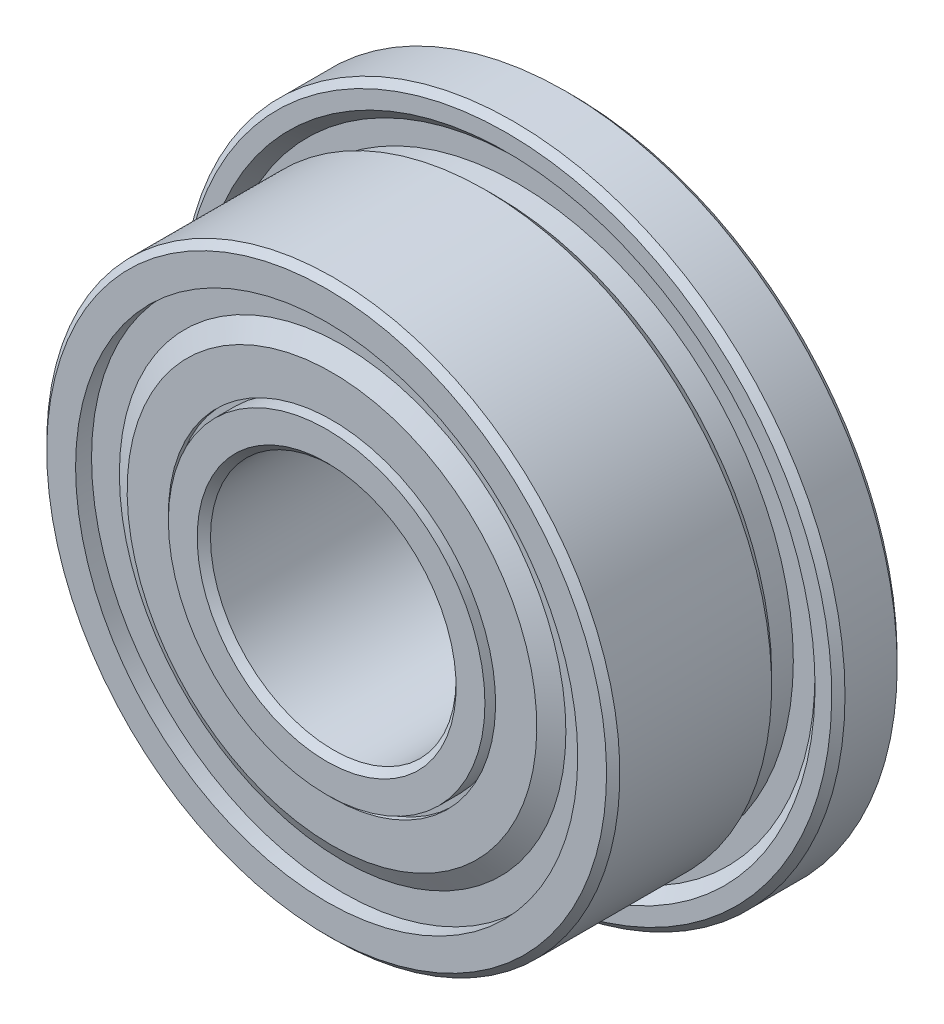
ISO-10303-21;
HEADER;
FILE_DESCRIPTION(('STEP AP214'),'2;1');
FILE_NAME('part.step','',(''),(''),'','','');
FILE_SCHEMA(('AUTOMOTIVE_DESIGN { 1 0 10303 214 1 1 1 1 }'));
ENDSEC;
DATA;
#1=APPLICATION_CONTEXT('core data for automotive mechanical design processes');
#2=APPLICATION_PROTOCOL_DEFINITION('international standard','automotive_design',2000,#1);
#3=PRODUCT_CONTEXT('',#1,'mechanical');
#4=PRODUCT('Part','Part','',(#3));
#5=PRODUCT_RELATED_PRODUCT_CATEGORY('part','',(#4));
#6=PRODUCT_DEFINITION_FORMATION('','',#4);
#7=PRODUCT_DEFINITION_CONTEXT('part definition',#1,'design');
#8=PRODUCT_DEFINITION('design','',#6,#7);
#9=PRODUCT_DEFINITION_SHAPE('','',#8);
#10=(LENGTH_UNIT() NAMED_UNIT(*) SI_UNIT(.MILLI.,.METRE.));
#11=(NAMED_UNIT(*) PLANE_ANGLE_UNIT() SI_UNIT($,.RADIAN.));
#12=(NAMED_UNIT(*) SI_UNIT($,.STERADIAN.) SOLID_ANGLE_UNIT());
#13=UNCERTAINTY_MEASURE_WITH_UNIT(LENGTH_MEASURE(1.E-05),#10,'distance_accuracy_value','');
#14=(GEOMETRIC_REPRESENTATION_CONTEXT(3) GLOBAL_UNCERTAINTY_ASSIGNED_CONTEXT((#13)) GLOBAL_UNIT_ASSIGNED_CONTEXT((#10,
#11,#12)) REPRESENTATION_CONTEXT('',''));
#15=CARTESIAN_POINT('',(0.,0.,0.));
#16=DIRECTION('',(0.,0.,1.));
#17=DIRECTION('',(1.,0.,0.));
#18=AXIS2_PLACEMENT_3D('',#15,#16,#17);
#19=CARTESIAN_POINT('',(0.,0.,0.));
#20=DIRECTION('',(0.,0.,1.));
#21=DIRECTION('',(0.,-1.,0.));
#22=AXIS2_PLACEMENT_3D('',#19,#20,#21);
#23=CYLINDRICAL_SURFACE('',#22,3.06666666666667);
#24=CARTESIAN_POINT('',(0.,0.,-1.24));
#25=DIRECTION('',(0.,0.,1.));
#26=DIRECTION('',(0.,-1.,0.));
#27=AXIS2_PLACEMENT_3D('',#24,#25,#26);
#28=CIRCLE('',#27,3.06666666666667);
#29=CARTESIAN_POINT('',(0.,-3.06666666666667,-1.24));
#30=VERTEX_POINT('',#29);
#31=EDGE_CURVE('E91',#30,#30,#28,.T.);
#32=ORIENTED_EDGE('',*,*,#31,.F.);
#33=EDGE_LOOP('',(#32));
#34=FACE_BOUND('',#33,.T.);
#35=CARTESIAN_POINT('',(0.,0.,-1.305));
#36=DIRECTION('',(0.,0.,1.));
#37=DIRECTION('',(0.,-1.,0.));
#38=AXIS2_PLACEMENT_3D('',#35,#36,#37);
#39=CIRCLE('',#38,3.06666666666667);
#40=CARTESIAN_POINT('',(0.,-3.06666666666667,-1.305));
#41=VERTEX_POINT('',#40);
#42=EDGE_CURVE('E12',#41,#41,#39,.T.);
#43=ORIENTED_EDGE('',*,*,#42,.T.);
#44=EDGE_LOOP('',(#43));
#45=FACE_BOUND('',#44,.T.);
#46=ADVANCED_FACE('F54',(#34,#45),#23,.T.);
#47=CARTESIAN_POINT('',(0.,3.06666666666667,-1.305));
#48=DIRECTION('',(0.,0.,1.));
#49=DIRECTION('',(0.,-1.,0.));
#50=AXIS2_PLACEMENT_3D('',#47,#48,#49);
#51=PLANE('',#50);
#52=ORIENTED_EDGE('',*,*,#42,.F.);
#53=EDGE_LOOP('',(#52));
#54=FACE_BOUND('',#53,.T.);
#55=CARTESIAN_POINT('',(0.,0.,-1.305));
#56=DIRECTION('',(0.,0.,1.));
#57=DIRECTION('',(0.,-1.,0.));
#58=AXIS2_PLACEMENT_3D('',#55,#56,#57);
#59=CIRCLE('',#58,2.72694050703183);
#60=CARTESIAN_POINT('',(0.,-2.72694050703183,-1.305));
#61=VERTEX_POINT('',#60);
#62=EDGE_CURVE('E61',#61,#61,#59,.T.);
#63=ORIENTED_EDGE('',*,*,#62,.T.);
#64=EDGE_LOOP('',(#63));
#65=FACE_BOUND('',#64,.T.);
#66=ADVANCED_FACE('F100',(#54,#65),#51,.F.);
#67=CARTESIAN_POINT('',(0.,0.,-1.435));
#68=DIRECTION('',(0.,0.,1.));
#69=DIRECTION('',(0.,-1.,0.));
#70=AXIS2_PLACEMENT_3D('',#67,#68,#69);
#71=CONICAL_SURFACE('',#70,2.50177390204788,1.0471975511966);
#72=ORIENTED_EDGE('',*,*,#62,.F.);
#73=EDGE_LOOP('',(#72));
#74=FACE_BOUND('',#73,.T.);
#75=CARTESIAN_POINT('',(0.,0.,-1.435));
#76=DIRECTION('',(0.,0.,1.));
#77=DIRECTION('',(0.,-1.,0.));
#78=AXIS2_PLACEMENT_3D('',#75,#76,#77);
#79=CIRCLE('',#78,2.50177390204788);
#80=CARTESIAN_POINT('',(0.,-2.50177390204788,-1.435));
#81=VERTEX_POINT('',#80);
#82=EDGE_CURVE('E67',#81,#81,#79,.T.);
#83=ORIENTED_EDGE('',*,*,#82,.T.);
#84=EDGE_LOOP('',(#83));
#85=FACE_BOUND('',#84,.T.);
#86=ADVANCED_FACE('F104',(#74,#85),#71,.T.);
#87=CARTESIAN_POINT('',(0.,2.50177390204788,-1.435));
#88=DIRECTION('',(0.,0.,1.));
#89=DIRECTION('',(0.,-1.,0.));
#90=AXIS2_PLACEMENT_3D('',#87,#88,#89);
#91=PLANE('',#90);
#92=ORIENTED_EDGE('',*,*,#82,.F.);
#93=EDGE_LOOP('',(#92));
#94=FACE_BOUND('',#93,.T.);
#95=CARTESIAN_POINT('',(0.,0.,-1.435));
#96=DIRECTION('',(0.,0.,1.));
#97=DIRECTION('',(0.,-1.,0.));
#98=AXIS2_PLACEMENT_3D('',#95,#96,#97);
#99=CIRCLE('',#98,1.99833333333333);
#100=CARTESIAN_POINT('',(0.,-1.99833333333333,-1.435));
#101=VERTEX_POINT('',#100);
#102=EDGE_CURVE('E73',#101,#101,#99,.T.);
#103=ORIENTED_EDGE('',*,*,#102,.T.);
#104=EDGE_LOOP('',(#103));
#105=FACE_BOUND('',#104,.T.);
#106=ADVANCED_FACE('F109',(#94,#105),#91,.F.);
#107=CARTESIAN_POINT('',(0.,0.,0.));
#108=DIRECTION('',(0.,0.,1.));
#109=DIRECTION('',(0.,-1.,0.));
#110=AXIS2_PLACEMENT_3D('',#107,#108,#109);
#111=CYLINDRICAL_SURFACE('',#110,1.99833333333333);
#112=ORIENTED_EDGE('',*,*,#102,.F.);
#113=EDGE_LOOP('',(#112));
#114=FACE_BOUND('',#113,.T.);
#115=CARTESIAN_POINT('',(0.,0.,-1.37));
#116=DIRECTION('',(0.,0.,1.));
#117=DIRECTION('',(0.,-1.,0.));
#118=AXIS2_PLACEMENT_3D('',#115,#116,#117);
#119=CIRCLE('',#118,1.99833333333333);
#120=CARTESIAN_POINT('',(0.,-1.99833333333333,-1.37));
#121=VERTEX_POINT('',#120);
#122=EDGE_CURVE('E79',#121,#121,#119,.T.);
#123=ORIENTED_EDGE('',*,*,#122,.T.);
#124=EDGE_LOOP('',(#123));
#125=FACE_BOUND('',#124,.T.);
#126=ADVANCED_FACE('F115',(#114,#125),#111,.F.);
#127=CARTESIAN_POINT('',(0.,2.48435720453986,-1.37));
#128=DIRECTION('',(0.,0.,-1.));
#129=DIRECTION('',(0.,1.,0.));
#130=AXIS2_PLACEMENT_3D('',#127,#128,#129);
#131=PLANE('',#130);
#132=ORIENTED_EDGE('',*,*,#122,.F.);
#133=EDGE_LOOP('',(#132));
#134=FACE_BOUND('',#133,.T.);
#135=CARTESIAN_POINT('',(0.,0.,-1.37));
#136=DIRECTION('',(0.,0.,1.));
#137=DIRECTION('',(0.,-1.,0.));
#138=AXIS2_PLACEMENT_3D('',#135,#136,#137);
#139=CIRCLE('',#138,2.48435720453986);
#140=CARTESIAN_POINT('',(0.,-2.48435720453986,-1.37));
#141=VERTEX_POINT('',#140);
#142=EDGE_CURVE('E83',#141,#141,#139,.T.);
#143=ORIENTED_EDGE('',*,*,#142,.T.);
#144=EDGE_LOOP('',(#143));
#145=FACE_BOUND('',#144,.T.);
#146=ADVANCED_FACE('F119',(#134,#145),#131,.F.);
#147=CARTESIAN_POINT('',(0.,0.,-1.24));
#148=DIRECTION('',(0.,0.,1.));
#149=DIRECTION('',(0.,-1.,0.));
#150=AXIS2_PLACEMENT_3D('',#147,#148,#149);
#151=CONICAL_SURFACE('',#150,2.70952380952381,1.0471975511966);
#152=ORIENTED_EDGE('',*,*,#142,.F.);
#153=EDGE_LOOP('',(#152));
#154=FACE_BOUND('',#153,.T.);
#155=CARTESIAN_POINT('',(0.,0.,-1.24));
#156=DIRECTION('',(0.,0.,1.));
#157=DIRECTION('',(0.,-1.,0.));
#158=AXIS2_PLACEMENT_3D('',#155,#156,#157);
#159=CIRCLE('',#158,2.70952380952381);
#160=CARTESIAN_POINT('',(0.,-2.70952380952381,-1.24));
#161=VERTEX_POINT('',#160);
#162=EDGE_CURVE('E87',#161,#161,#159,.T.);
#163=ORIENTED_EDGE('',*,*,#162,.T.);
#164=EDGE_LOOP('',(#163));
#165=FACE_BOUND('',#164,.T.);
#166=ADVANCED_FACE('F123',(#154,#165),#151,.F.);
#167=CARTESIAN_POINT('',(0.,3.06666666666667,-1.24));
#168=DIRECTION('',(0.,0.,-1.));
#169=DIRECTION('',(0.,1.,0.));
#170=AXIS2_PLACEMENT_3D('',#167,#168,#169);
#171=PLANE('',#170);
#172=ORIENTED_EDGE('',*,*,#162,.F.);
#173=EDGE_LOOP('',(#172));
#174=FACE_BOUND('',#173,.T.);
#175=ORIENTED_EDGE('',*,*,#31,.T.);
#176=EDGE_LOOP('',(#175));
#177=FACE_BOUND('',#176,.T.);
#178=ADVANCED_FACE('F97',(#174,#177),#171,.F.);
#179=CLOSED_SHELL('',(#46,#66,#86,#106,#126,#146,#166,#178));
#180=MANIFOLD_SOLID_BREP('B2',#179);
#181=CARTESIAN_POINT('',(0.,0.,0.));
#182=DIRECTION('',(0.,0.,1.));
#183=DIRECTION('',(0.,-1.,0.));
#184=AXIS2_PLACEMENT_3D('',#181,#182,#183);
#185=CYLINDRICAL_SURFACE('',#184,3.06666666666667);
#186=CARTESIAN_POINT('',(0.,0.,1.305));
#187=DIRECTION('',(0.,0.,1.));
#188=DIRECTION('',(0.,-1.,0.));
#189=AXIS2_PLACEMENT_3D('',#186,#187,#188);
#190=CIRCLE('',#189,3.06666666666667);
#191=CARTESIAN_POINT('',(0.,-3.06666666666667,1.305));
#192=VERTEX_POINT('',#191);
#193=EDGE_CURVE('E53',#192,#192,#190,.T.);
#194=ORIENTED_EDGE('',*,*,#193,.F.);
#195=EDGE_LOOP('',(#194));
#196=FACE_BOUND('',#195,.T.);
#197=CARTESIAN_POINT('',(0.,0.,1.24));
#198=DIRECTION('',(0.,0.,1.));
#199=DIRECTION('',(0.,-1.,0.));
#200=AXIS2_PLACEMENT_3D('',#197,#198,#199);
#201=CIRCLE('',#200,3.06666666666667);
#202=CARTESIAN_POINT('',(0.,-3.06666666666667,1.24));
#203=VERTEX_POINT('',#202);
#204=EDGE_CURVE('E235',#203,#203,#201,.T.);
#205=ORIENTED_EDGE('',*,*,#204,.T.);
#206=EDGE_LOOP('',(#205));
#207=FACE_BOUND('',#206,.T.);
#208=ADVANCED_FACE('F198',(#196,#207),#185,.T.);
#209=CARTESIAN_POINT('',(0.,3.06666666666667,1.305));
#210=DIRECTION('',(0.,0.,-1.));
#211=DIRECTION('',(0.,1.,0.));
#212=AXIS2_PLACEMENT_3D('',#209,#210,#211);
#213=PLANE('',#212);
#214=CARTESIAN_POINT('',(0.,0.,1.305));
#215=DIRECTION('',(0.,0.,1.));
#216=DIRECTION('',(0.,-1.,0.));
#217=AXIS2_PLACEMENT_3D('',#214,#215,#216);
#218=CIRCLE('',#217,2.72694050703183);
#219=CARTESIAN_POINT('',(0.,-2.72694050703183,1.305));
#220=VERTEX_POINT('',#219);
#221=EDGE_CURVE('E205',#220,#220,#218,.T.);
#222=ORIENTED_EDGE('',*,*,#221,.F.);
#223=EDGE_LOOP('',(#222));
#224=FACE_BOUND('',#223,.T.);
#225=ORIENTED_EDGE('',*,*,#193,.T.);
#226=EDGE_LOOP('',(#225));
#227=FACE_BOUND('',#226,.T.);
#228=ADVANCED_FACE('F274',(#224,#227),#213,.F.);
#229=CARTESIAN_POINT('',(0.,0.,1.305));
#230=DIRECTION('',(0.,0.,-1.));
#231=DIRECTION('',(0.,1.,0.));
#232=AXIS2_PLACEMENT_3D('',#229,#230,#231);
#233=CONICAL_SURFACE('',#232,2.72694050703183,1.0471975511966);
#234=CARTESIAN_POINT('',(0.,0.,1.435));
#235=DIRECTION('',(0.,0.,1.));
#236=DIRECTION('',(0.,-1.,0.));
#237=AXIS2_PLACEMENT_3D('',#234,#235,#236);
#238=CIRCLE('',#237,2.50177390204788);
#239=CARTESIAN_POINT('',(0.,-2.50177390204788,1.435));
#240=VERTEX_POINT('',#239);
#241=EDGE_CURVE('E211',#240,#240,#238,.T.);
#242=ORIENTED_EDGE('',*,*,#241,.F.);
#243=EDGE_LOOP('',(#242));
#244=FACE_BOUND('',#243,.T.);
#245=ORIENTED_EDGE('',*,*,#221,.T.);
#246=EDGE_LOOP('',(#245));
#247=FACE_BOUND('',#246,.T.);
#248=ADVANCED_FACE('F269',(#244,#247),#233,.T.);
#249=CARTESIAN_POINT('',(0.,2.50177390204788,1.435));
#250=DIRECTION('',(0.,0.,-1.));
#251=DIRECTION('',(0.,1.,0.));
#252=AXIS2_PLACEMENT_3D('',#249,#250,#251);
#253=PLANE('',#252);
#254=CARTESIAN_POINT('',(0.,0.,1.435));
#255=DIRECTION('',(0.,0.,1.));
#256=DIRECTION('',(0.,-1.,0.));
#257=AXIS2_PLACEMENT_3D('',#254,#255,#256);
#258=CIRCLE('',#257,1.99833333333333);
#259=CARTESIAN_POINT('',(0.,-1.99833333333333,1.435));
#260=VERTEX_POINT('',#259);
#261=EDGE_CURVE('E217',#260,#260,#258,.T.);
#262=ORIENTED_EDGE('',*,*,#261,.F.);
#263=EDGE_LOOP('',(#262));
#264=FACE_BOUND('',#263,.T.);
#265=ORIENTED_EDGE('',*,*,#241,.T.);
#266=EDGE_LOOP('',(#265));
#267=FACE_BOUND('',#266,.T.);
#268=ADVANCED_FACE('F263',(#264,#267),#253,.F.);
#269=CARTESIAN_POINT('',(0.,0.,0.));
#270=DIRECTION('',(0.,0.,1.));
#271=DIRECTION('',(0.,-1.,0.));
#272=AXIS2_PLACEMENT_3D('',#269,#270,#271);
#273=CYLINDRICAL_SURFACE('',#272,1.99833333333333);
#274=CARTESIAN_POINT('',(0.,0.,1.37));
#275=DIRECTION('',(0.,0.,1.));
#276=DIRECTION('',(0.,-1.,0.));
#277=AXIS2_PLACEMENT_3D('',#274,#275,#276);
#278=CIRCLE('',#277,1.99833333333333);
#279=CARTESIAN_POINT('',(0.,-1.99833333333333,1.37));
#280=VERTEX_POINT('',#279);
#281=EDGE_CURVE('E223',#280,#280,#278,.T.);
#282=ORIENTED_EDGE('',*,*,#281,.F.);
#283=EDGE_LOOP('',(#282));
#284=FACE_BOUND('',#283,.T.);
#285=ORIENTED_EDGE('',*,*,#261,.T.);
#286=EDGE_LOOP('',(#285));
#287=FACE_BOUND('',#286,.T.);
#288=ADVANCED_FACE('F257',(#284,#287),#273,.F.);
#289=CARTESIAN_POINT('',(0.,2.48435720453986,1.37));
#290=DIRECTION('',(0.,0.,1.));
#291=DIRECTION('',(0.,-1.,0.));
#292=AXIS2_PLACEMENT_3D('',#289,#290,#291);
#293=PLANE('',#292);
#294=CARTESIAN_POINT('',(0.,0.,1.37));
#295=DIRECTION('',(0.,0.,1.));
#296=DIRECTION('',(0.,-1.,0.));
#297=AXIS2_PLACEMENT_3D('',#294,#295,#296);
#298=CIRCLE('',#297,2.48435720453986);
#299=CARTESIAN_POINT('',(0.,-2.48435720453986,1.37));
#300=VERTEX_POINT('',#299);
#301=EDGE_CURVE('E227',#300,#300,#298,.T.);
#302=ORIENTED_EDGE('',*,*,#301,.F.);
#303=EDGE_LOOP('',(#302));
#304=FACE_BOUND('',#303,.T.);
#305=ORIENTED_EDGE('',*,*,#281,.T.);
#306=EDGE_LOOP('',(#305));
#307=FACE_BOUND('',#306,.T.);
#308=ADVANCED_FACE('F251',(#304,#307),#293,.F.);
#309=CARTESIAN_POINT('',(0.,0.,1.37));
#310=DIRECTION('',(0.,0.,-1.));
#311=DIRECTION('',(0.,1.,0.));
#312=AXIS2_PLACEMENT_3D('',#309,#310,#311);
#313=CONICAL_SURFACE('',#312,2.48435720453986,1.0471975511966);
#314=CARTESIAN_POINT('',(0.,0.,1.24));
#315=DIRECTION('',(0.,0.,1.));
#316=DIRECTION('',(0.,-1.,0.));
#317=AXIS2_PLACEMENT_3D('',#314,#315,#316);
#318=CIRCLE('',#317,2.70952380952381);
#319=CARTESIAN_POINT('',(0.,-2.70952380952381,1.24));
#320=VERTEX_POINT('',#319);
#321=EDGE_CURVE('E231',#320,#320,#318,.T.);
#322=ORIENTED_EDGE('',*,*,#321,.F.);
#323=EDGE_LOOP('',(#322));
#324=FACE_BOUND('',#323,.T.);
#325=ORIENTED_EDGE('',*,*,#301,.T.);
#326=EDGE_LOOP('',(#325));
#327=FACE_BOUND('',#326,.T.);
#328=ADVANCED_FACE('F245',(#324,#327),#313,.F.);
#329=CARTESIAN_POINT('',(0.,3.06666666666667,1.24));
#330=DIRECTION('',(0.,0.,1.));
#331=DIRECTION('',(0.,-1.,0.));
#332=AXIS2_PLACEMENT_3D('',#329,#330,#331);
#333=PLANE('',#332);
#334=ORIENTED_EDGE('',*,*,#204,.F.);
#335=EDGE_LOOP('',(#334));
#336=FACE_BOUND('',#335,.T.);
#337=ORIENTED_EDGE('',*,*,#321,.T.);
#338=EDGE_LOOP('',(#337));
#339=FACE_BOUND('',#338,.T.);
#340=ADVANCED_FACE('F242',(#336,#339),#333,.F.);
#341=CLOSED_SHELL('',(#208,#228,#248,#268,#288,#308,#328,#340));
#342=MANIFOLD_SOLID_BREP('B7',#341);
#343=CARTESIAN_POINT('',(-1.24999999999997,2.16506350946111,0.));
#344=DIRECTION('',(-0.499999999999989,0.866025403784445,0.));
#345=DIRECTION('',(0.866025403784445,0.499999999999989,0.));
#346=AXIS2_PLACEMENT_3D('',#343,#344,#345);
#347=SPHERICAL_SURFACE('',#346,0.5);
#348=CARTESIAN_POINT('',(-1.49999999999997,2.59807621135334,0.));
#349=VERTEX_POINT('',#348);
#350=VERTEX_LOOP('',#349);
#351=FACE_BOUND('',#350,.T.);
#352=ADVANCED_FACE('F342',(#351),#347,.T.);
#353=CLOSED_SHELL('',(#352));
#354=MANIFOLD_SOLID_BREP('B48',#353);
#355=CARTESIAN_POINT('',(-2.16506350946108,1.25000000000003,0.));
#356=DIRECTION('',(-0.866025403784433,0.50000000000001,0.));
#357=DIRECTION('',(0.50000000000001,0.866025403784433,0.));
#358=AXIS2_PLACEMENT_3D('',#355,#356,#357);
#359=SPHERICAL_SURFACE('',#358,0.5);
#360=CARTESIAN_POINT('',(-2.5980762113533,1.50000000000003,0.));
#361=VERTEX_POINT('',#360);
#362=VERTEX_LOOP('',#361);
#363=FACE_BOUND('',#362,.T.);
#364=ADVANCED_FACE('F361',(#363),#359,.T.);
#365=CLOSED_SHELL('',(#364));
#366=MANIFOLD_SOLID_BREP('B194',#365);
#367=CARTESIAN_POINT('',(-2.5,0.,0.));
#368=DIRECTION('',(-1.,0.,0.));
#369=DIRECTION('',(0.,1.,0.));
#370=AXIS2_PLACEMENT_3D('',#367,#368,#369);
#371=SPHERICAL_SURFACE('',#370,0.5);
#372=CARTESIAN_POINT('',(-3.,0.,0.));
#373=VERTEX_POINT('',#372);
#374=VERTEX_LOOP('',#373);
#375=FACE_BOUND('',#374,.T.);
#376=ADVANCED_FACE('F380',(#375),#371,.T.);
#377=CLOSED_SHELL('',(#376));
#378=MANIFOLD_SOLID_BREP('B338',#377);
#379=CARTESIAN_POINT('',(-2.16506350946111,-1.24999999999998,0.));
#380=DIRECTION('',(-0.866025403784443,-0.499999999999992,0.));
#381=DIRECTION('',(-0.499999999999992,0.866025403784443,0.));
#382=AXIS2_PLACEMENT_3D('',#379,#380,#381);
#383=SPHERICAL_SURFACE('',#382,0.5);
#384=CARTESIAN_POINT('',(-2.59807621135333,-1.49999999999998,0.));
#385=VERTEX_POINT('',#384);
#386=VERTEX_LOOP('',#385);
#387=FACE_BOUND('',#386,.T.);
#388=ADVANCED_FACE('F399',(#387),#383,.T.);
#389=CLOSED_SHELL('',(#388));
#390=MANIFOLD_SOLID_BREP('B357',#389);
#391=CARTESIAN_POINT('',(-1.25000000000002,-2.16506350946109,0.));
#392=DIRECTION('',(-0.500000000000007,-0.866025403784435,0.));
#393=DIRECTION('',(-0.866025403784435,0.500000000000007,0.));
#394=AXIS2_PLACEMENT_3D('',#391,#392,#393);
#395=SPHERICAL_SURFACE('',#394,0.5);
#396=CARTESIAN_POINT('',(-1.50000000000002,-2.5980762113533,0.));
#397=VERTEX_POINT('',#396);
#398=VERTEX_LOOP('',#397);
#399=FACE_BOUND('',#398,.T.);
#400=ADVANCED_FACE('F418',(#399),#395,.T.);
#401=CLOSED_SHELL('',(#400));
#402=MANIFOLD_SOLID_BREP('B376',#401);
#403=CARTESIAN_POINT('',(0.,-2.5,0.));
#404=DIRECTION('',(0.,-1.,0.));
#405=DIRECTION('',(-1.,0.,0.));
#406=AXIS2_PLACEMENT_3D('',#403,#404,#405);
#407=SPHERICAL_SURFACE('',#406,0.5);
#408=CARTESIAN_POINT('',(0.,-3.,0.));
#409=VERTEX_POINT('',#408);
#410=VERTEX_LOOP('',#409);
#411=FACE_BOUND('',#410,.T.);
#412=ADVANCED_FACE('F437',(#411),#407,.T.);
#413=CLOSED_SHELL('',(#412));
#414=MANIFOLD_SOLID_BREP('B395',#413);
#415=CARTESIAN_POINT('',(1.24999999999999,-2.1650635094611,0.));
#416=DIRECTION('',(0.499999999999995,-0.866025403784442,0.));
#417=DIRECTION('',(-0.866025403784442,-0.499999999999995,0.));
#418=AXIS2_PLACEMENT_3D('',#415,#416,#417);
#419=SPHERICAL_SURFACE('',#418,0.5);
#420=CARTESIAN_POINT('',(1.49999999999998,-2.59807621135332,0.));
#421=VERTEX_POINT('',#420);
#422=VERTEX_LOOP('',#421);
#423=FACE_BOUND('',#422,.T.);
#424=ADVANCED_FACE('F456',(#423),#419,.T.);
#425=CLOSED_SHELL('',(#424));
#426=MANIFOLD_SOLID_BREP('B414',#425);
#427=CARTESIAN_POINT('',(2.16506350946109,-1.25000000000001,0.));
#428=DIRECTION('',(0.866025403784436,-0.500000000000004,0.));
#429=DIRECTION('',(-0.500000000000004,-0.866025403784436,0.));
#430=AXIS2_PLACEMENT_3D('',#427,#428,#429);
#431=SPHERICAL_SURFACE('',#430,0.5);
#432=CARTESIAN_POINT('',(2.59807621135331,-1.50000000000001,0.));
#433=VERTEX_POINT('',#432);
#434=VERTEX_LOOP('',#433);
#435=FACE_BOUND('',#434,.T.);
#436=ADVANCED_FACE('F475',(#435),#431,.T.);
#437=CLOSED_SHELL('',(#436));
#438=MANIFOLD_SOLID_BREP('B433',#437);
#439=CARTESIAN_POINT('',(2.5,0.,0.));
#440=DIRECTION('',(1.,0.,0.));
#441=DIRECTION('',(0.,-1.,0.));
#442=AXIS2_PLACEMENT_3D('',#439,#440,#441);
#443=SPHERICAL_SURFACE('',#442,0.5);
#444=CARTESIAN_POINT('',(3.,0.,0.));
#445=VERTEX_POINT('',#444);
#446=VERTEX_LOOP('',#445);
#447=FACE_BOUND('',#446,.T.);
#448=ADVANCED_FACE('F494',(#447),#443,.T.);
#449=CLOSED_SHELL('',(#448));
#450=MANIFOLD_SOLID_BREP('B452',#449);
#451=CARTESIAN_POINT('',(2.1650635094611,1.25,0.));
#452=DIRECTION('',(0.86602540378444,0.499999999999998,0.));
#453=DIRECTION('',(0.499999999999998,-0.86602540378444,0.));
#454=AXIS2_PLACEMENT_3D('',#451,#452,#453);
#455=SPHERICAL_SURFACE('',#454,0.5);
#456=CARTESIAN_POINT('',(2.59807621135332,1.49999999999999,0.));
#457=VERTEX_POINT('',#456);
#458=VERTEX_LOOP('',#457);
#459=FACE_BOUND('',#458,.T.);
#460=ADVANCED_FACE('F513',(#459),#455,.T.);
#461=CLOSED_SHELL('',(#460));
#462=MANIFOLD_SOLID_BREP('B471',#461);
#463=CARTESIAN_POINT('',(1.25,2.1650635094611,0.));
#464=DIRECTION('',(0.500000000000001,0.866025403784438,0.));
#465=DIRECTION('',(0.866025403784438,-0.500000000000001,0.));
#466=AXIS2_PLACEMENT_3D('',#463,#464,#465);
#467=SPHERICAL_SURFACE('',#466,0.5);
#468=CARTESIAN_POINT('',(1.5,2.59807621135331,0.));
#469=VERTEX_POINT('',#468);
#470=VERTEX_LOOP('',#469);
#471=FACE_BOUND('',#470,.T.);
#472=ADVANCED_FACE('F532',(#471),#467,.T.);
#473=CLOSED_SHELL('',(#472));
#474=MANIFOLD_SOLID_BREP('B490',#473);
#475=CARTESIAN_POINT('',(0.,2.5,0.));
#476=DIRECTION('',(0.,1.,0.));
#477=DIRECTION('',(1.,0.,0.));
#478=AXIS2_PLACEMENT_3D('',#475,#476,#477);
#479=SPHERICAL_SURFACE('',#478,0.5);
#480=CARTESIAN_POINT('',(0.,3.,0.));
#481=VERTEX_POINT('',#480);
#482=VERTEX_LOOP('',#481);
#483=FACE_BOUND('',#482,.T.);
#484=ADVANCED_FACE('F554',(#483),#479,.T.);
#485=CLOSED_SHELL('',(#484));
#486=MANIFOLD_SOLID_BREP('B509',#485);
#487=CARTESIAN_POINT('',(0.,0.,0.));
#488=DIRECTION('',(0.,0.,1.));
#489=DIRECTION('',(0.,-1.,0.));
#490=AXIS2_PLACEMENT_3D('',#487,#488,#489);
#491=CYLINDRICAL_SURFACE('',#490,2.15);
#492=CARTESIAN_POINT('',(0.,0.,0.357071421427142));
#493=DIRECTION('',(0.,0.,1.));
#494=DIRECTION('',(0.,-1.,0.));
#495=AXIS2_PLACEMENT_3D('',#492,#493,#494);
#496=CIRCLE('',#495,2.15);
#497=CARTESIAN_POINT('',(0.,-2.15,0.357071421427142));
#498=VERTEX_POINT('',#497);
#499=EDGE_CURVE('E606',#498,#498,#496,.T.);
#500=ORIENTED_EDGE('',*,*,#499,.T.);
#501=EDGE_LOOP('',(#500));
#502=FACE_BOUND('',#501,.T.);
#503=CARTESIAN_POINT('',(0.,0.,1.24));
#504=DIRECTION('',(0.,0.,1.));
#505=DIRECTION('',(0.,-1.,0.));
#506=AXIS2_PLACEMENT_3D('',#503,#504,#505);
#507=CIRCLE('',#506,2.15);
#508=CARTESIAN_POINT('',(0.,-2.15,1.24));
#509=VERTEX_POINT('',#508);
#510=EDGE_CURVE('E630',#509,#509,#507,.T.);
#511=ORIENTED_EDGE('',*,*,#510,.F.);
#512=EDGE_LOOP('',(#511));
#513=FACE_BOUND('',#512,.T.);
#514=ADVANCED_FACE('F576',(#502,#513),#491,.T.);
#515=CARTESIAN_POINT('',(0.,1.5,1.5));
#516=DIRECTION('',(0.,0.,-1.));
#517=DIRECTION('',(0.,1.,0.));
#518=AXIS2_PLACEMENT_3D('',#515,#516,#517);
#519=PLANE('',#518);
#520=CARTESIAN_POINT('',(0.,0.,1.5));
#521=DIRECTION('',(0.,0.,-1.));
#522=DIRECTION('',(0.,1.,0.));
#523=AXIS2_PLACEMENT_3D('',#520,#521,#522);
#524=CIRCLE('',#523,1.58125);
#525=CARTESIAN_POINT('',(0.,1.58125,1.5));
#526=VERTEX_POINT('',#525);
#527=EDGE_CURVE('E553',#526,#526,#524,.T.);
#528=ORIENTED_EDGE('',*,*,#527,.T.);
#529=EDGE_LOOP('',(#528));
#530=FACE_BOUND('',#529,.T.);
#531=CARTESIAN_POINT('',(0.,0.,1.5));
#532=DIRECTION('',(0.,0.,1.));
#533=DIRECTION('',(0.,-1.,0.));
#534=AXIS2_PLACEMENT_3D('',#531,#532,#533);
#535=CIRCLE('',#534,1.93333333333333);
#536=CARTESIAN_POINT('',(0.,-1.93333333333333,1.5));
#537=VERTEX_POINT('',#536);
#538=EDGE_CURVE('E622',#537,#537,#535,.T.);
#539=ORIENTED_EDGE('',*,*,#538,.T.);
#540=EDGE_LOOP('',(#539));
#541=FACE_BOUND('',#540,.T.);
#542=ADVANCED_FACE('F640',(#530,#541),#519,.F.);
#543=CARTESIAN_POINT('',(0.,0.,0.));
#544=DIRECTION('',(0.,0.,1.));
#545=DIRECTION('',(0.,-1.,0.));
#546=AXIS2_PLACEMENT_3D('',#543,#544,#545);
#547=CYLINDRICAL_SURFACE('',#546,2.15);
#548=CARTESIAN_POINT('',(0.,0.,-0.357071421427143));
#549=DIRECTION('',(0.,0.,1.));
#550=DIRECTION('',(0.,-1.,0.));
#551=AXIS2_PLACEMENT_3D('',#548,#549,#550);
#552=CIRCLE('',#551,2.15);
#553=CARTESIAN_POINT('',(0.,-2.15,-0.357071421427143));
#554=VERTEX_POINT('',#553);
#555=EDGE_CURVE('E602',#554,#554,#552,.T.);
#556=ORIENTED_EDGE('',*,*,#555,.F.);
#557=EDGE_LOOP('',(#556));
#558=FACE_BOUND('',#557,.T.);
#559=CARTESIAN_POINT('',(0.,0.,-1.24));
#560=DIRECTION('',(0.,0.,1.));
#561=DIRECTION('',(0.,-1.,0.));
#562=AXIS2_PLACEMENT_3D('',#559,#560,#561);
#563=CIRCLE('',#562,2.15);
#564=CARTESIAN_POINT('',(0.,-2.15,-1.24));
#565=VERTEX_POINT('',#564);
#566=EDGE_CURVE('E618',#565,#565,#563,.T.);
#567=ORIENTED_EDGE('',*,*,#566,.T.);
#568=EDGE_LOOP('',(#567));
#569=FACE_BOUND('',#568,.T.);
#570=ADVANCED_FACE('F646',(#558,#569),#547,.T.);
#571=CARTESIAN_POINT('',(0.,2.15,-1.5));
#572=DIRECTION('',(0.,0.,1.));
#573=DIRECTION('',(0.,-1.,0.));
#574=AXIS2_PLACEMENT_3D('',#571,#572,#573);
#575=PLANE('',#574);
#576=CARTESIAN_POINT('',(0.,0.,-1.5));
#577=DIRECTION('',(0.,0.,1.));
#578=DIRECTION('',(0.,-1.,0.));
#579=AXIS2_PLACEMENT_3D('',#576,#577,#578);
#580=CIRCLE('',#579,1.58125);
#581=CARTESIAN_POINT('',(0.,-1.58125,-1.5));
#582=VERTEX_POINT('',#581);
#583=EDGE_CURVE('E596',#582,#582,#580,.T.);
#584=ORIENTED_EDGE('',*,*,#583,.T.);
#585=EDGE_LOOP('',(#584));
#586=FACE_BOUND('',#585,.T.);
#587=CARTESIAN_POINT('',(0.,0.,-1.5));
#588=DIRECTION('',(0.,0.,1.));
#589=DIRECTION('',(0.,-1.,0.));
#590=AXIS2_PLACEMENT_3D('',#587,#588,#589);
#591=CIRCLE('',#590,1.93333333333333);
#592=CARTESIAN_POINT('',(0.,-1.93333333333333,-1.5));
#593=VERTEX_POINT('',#592);
#594=EDGE_CURVE('E610',#593,#593,#591,.T.);
#595=ORIENTED_EDGE('',*,*,#594,.F.);
#596=EDGE_LOOP('',(#595));
#597=FACE_BOUND('',#596,.T.);
#598=ADVANCED_FACE('F654',(#586,#597),#575,.F.);
#599=CARTESIAN_POINT('',(0.,0.,0.));
#600=DIRECTION('',(0.,0.,1.));
#601=DIRECTION('',(0.,-1.,0.));
#602=AXIS2_PLACEMENT_3D('',#599,#600,#601);
#603=TOROIDAL_SURFACE('',#602,2.5,0.5);
#604=ORIENTED_EDGE('',*,*,#499,.F.);
#605=EDGE_LOOP('',(#604));
#606=FACE_BOUND('',#605,.T.);
#607=ORIENTED_EDGE('',*,*,#555,.T.);
#608=EDGE_LOOP('',(#607));
#609=FACE_BOUND('',#608,.T.);
#610=ADVANCED_FACE('F650',(#606,#609),#603,.F.);
#611=CARTESIAN_POINT('',(0.,0.,0.));
#612=DIRECTION('',(0.,0.,1.));
#613=DIRECTION('',(0.,-1.,0.));
#614=AXIS2_PLACEMENT_3D('',#611,#612,#613);
#615=CYLINDRICAL_SURFACE('',#614,1.5);
#616=CARTESIAN_POINT('',(0.,0.,-1.41875));
#617=DIRECTION('',(0.,0.,1.));
#618=DIRECTION('',(0.,-1.,0.));
#619=AXIS2_PLACEMENT_3D('',#616,#617,#618);
#620=CIRCLE('',#619,1.5);
#621=CARTESIAN_POINT('',(0.,-1.5,-1.41875));
#622=VERTEX_POINT('',#621);
#623=EDGE_CURVE('E584',#622,#622,#620,.F.);
#624=ORIENTED_EDGE('',*,*,#623,.T.);
#625=EDGE_LOOP('',(#624));
#626=FACE_BOUND('',#625,.T.);
#627=CARTESIAN_POINT('',(0.,0.,1.41875));
#628=DIRECTION('',(0.,0.,-1.));
#629=DIRECTION('',(0.,1.,0.));
#630=AXIS2_PLACEMENT_3D('',#627,#628,#629);
#631=CIRCLE('',#630,1.5);
#632=CARTESIAN_POINT('',(0.,1.5,1.41875));
#633=VERTEX_POINT('',#632);
#634=EDGE_CURVE('E590',#633,#633,#631,.F.);
#635=ORIENTED_EDGE('',*,*,#634,.T.);
#636=EDGE_LOOP('',(#635));
#637=FACE_BOUND('',#636,.T.);
#638=ADVANCED_FACE('F653',(#626,#637),#615,.F.);
#639=CARTESIAN_POINT('',(0.,0.,-1.5));
#640=DIRECTION('',(0.,0.,-1.));
#641=DIRECTION('',(0.,1.,0.));
#642=AXIS2_PLACEMENT_3D('',#639,#640,#641);
#643=CONICAL_SURFACE('',#642,1.58125,0.785398163397448);
#644=ORIENTED_EDGE('',*,*,#623,.F.);
#645=EDGE_LOOP('',(#644));
#646=FACE_BOUND('',#645,.T.);
#647=ORIENTED_EDGE('',*,*,#583,.F.);
#648=EDGE_LOOP('',(#647));
#649=FACE_BOUND('',#648,.T.);
#650=ADVANCED_FACE('F658',(#646,#649),#643,.F.);
#651=CARTESIAN_POINT('',(0.,0.,1.41875));
#652=DIRECTION('',(0.,0.,1.));
#653=DIRECTION('',(0.,-1.,0.));
#654=AXIS2_PLACEMENT_3D('',#651,#652,#653);
#655=CONICAL_SURFACE('',#654,1.5,0.785398163397448);
#656=ORIENTED_EDGE('',*,*,#527,.F.);
#657=EDGE_LOOP('',(#656));
#658=FACE_BOUND('',#657,.T.);
#659=ORIENTED_EDGE('',*,*,#634,.F.);
#660=EDGE_LOOP('',(#659));
#661=FACE_BOUND('',#660,.T.);
#662=ADVANCED_FACE('F578',(#658,#661),#655,.F.);
#663=CARTESIAN_POINT('',(0.,0.,0.));
#664=DIRECTION('',(0.,0.,1.));
#665=DIRECTION('',(0.,-1.,0.));
#666=AXIS2_PLACEMENT_3D('',#663,#664,#665);
#667=CYLINDRICAL_SURFACE('',#666,1.93333333333333);
#668=ORIENTED_EDGE('',*,*,#594,.T.);
#669=EDGE_LOOP('',(#668));
#670=FACE_BOUND('',#669,.T.);
#671=CARTESIAN_POINT('',(0.,0.,-1.24));
#672=DIRECTION('',(0.,0.,1.));
#673=DIRECTION('',(0.,-1.,0.));
#674=AXIS2_PLACEMENT_3D('',#671,#672,#673);
#675=CIRCLE('',#674,1.93333333333333);
#676=CARTESIAN_POINT('',(0.,-1.93333333333333,-1.24));
#677=VERTEX_POINT('',#676);
#678=EDGE_CURVE('E614',#677,#677,#675,.T.);
#679=ORIENTED_EDGE('',*,*,#678,.F.);
#680=EDGE_LOOP('',(#679));
#681=FACE_BOUND('',#680,.T.);
#682=ADVANCED_FACE('F665',(#670,#681),#667,.T.);
#683=CARTESIAN_POINT('',(0.,2.15,-1.24));
#684=DIRECTION('',(0.,0.,-1.));
#685=DIRECTION('',(0.,1.,0.));
#686=AXIS2_PLACEMENT_3D('',#683,#684,#685);
#687=PLANE('',#686);
#688=ORIENTED_EDGE('',*,*,#678,.T.);
#689=EDGE_LOOP('',(#688));
#690=FACE_BOUND('',#689,.T.);
#691=ORIENTED_EDGE('',*,*,#566,.F.);
#692=EDGE_LOOP('',(#691));
#693=FACE_BOUND('',#692,.T.);
#694=ADVANCED_FACE('F677',(#690,#693),#687,.T.);
#695=CARTESIAN_POINT('',(0.,0.,0.));
#696=DIRECTION('',(0.,0.,1.));
#697=DIRECTION('',(0.,-1.,0.));
#698=AXIS2_PLACEMENT_3D('',#695,#696,#697);
#699=CYLINDRICAL_SURFACE('',#698,1.93333333333333);
#700=CARTESIAN_POINT('',(0.,0.,1.24));
#701=DIRECTION('',(0.,0.,1.));
#702=DIRECTION('',(0.,-1.,0.));
#703=AXIS2_PLACEMENT_3D('',#700,#701,#702);
#704=CIRCLE('',#703,1.93333333333333);
#705=CARTESIAN_POINT('',(0.,-1.93333333333333,1.24));
#706=VERTEX_POINT('',#705);
#707=EDGE_CURVE('E626',#706,#706,#704,.T.);
#708=ORIENTED_EDGE('',*,*,#707,.T.);
#709=EDGE_LOOP('',(#708));
#710=FACE_BOUND('',#709,.T.);
#711=ORIENTED_EDGE('',*,*,#538,.F.);
#712=EDGE_LOOP('',(#711));
#713=FACE_BOUND('',#712,.T.);
#714=ADVANCED_FACE('F683',(#710,#713),#699,.T.);
#715=CARTESIAN_POINT('',(0.,2.15,1.24));
#716=DIRECTION('',(0.,0.,1.));
#717=DIRECTION('',(0.,-1.,0.));
#718=AXIS2_PLACEMENT_3D('',#715,#716,#717);
#719=PLANE('',#718);
#720=ORIENTED_EDGE('',*,*,#510,.T.);
#721=EDGE_LOOP('',(#720));
#722=FACE_BOUND('',#721,.T.);
#723=ORIENTED_EDGE('',*,*,#707,.F.);
#724=EDGE_LOOP('',(#723));
#725=FACE_BOUND('',#724,.T.);
#726=ADVANCED_FACE('F636',(#722,#725),#719,.T.);
#727=CLOSED_SHELL('',(#514,#542,#570,#598,#610,#638,#650,#662,#682,#694,#714,#726));
#728=MANIFOLD_SOLID_BREP('B528',#727);
#729=CARTESIAN_POINT('',(0.,2.85,-1.5));
#730=DIRECTION('',(0.,0.,1.));
#731=DIRECTION('',(0.,-1.,0.));
#732=AXIS2_PLACEMENT_3D('',#729,#730,#731);
#733=PLANE('',#732);
#734=CARTESIAN_POINT('',(0.,0.,-1.5));
#735=DIRECTION('',(0.,0.,1.));
#736=DIRECTION('',(0.,-1.,0.));
#737=AXIS2_PLACEMENT_3D('',#734,#735,#736);
#738=CIRCLE('',#737,3.96875);
#739=CARTESIAN_POINT('',(0.,-3.96875,-1.5));
#740=VERTEX_POINT('',#739);
#741=EDGE_CURVE('E803',#740,#740,#738,.F.);
#742=ORIENTED_EDGE('',*,*,#741,.T.);
#743=EDGE_LOOP('',(#742));
#744=FACE_BOUND('',#743,.T.);
#745=CARTESIAN_POINT('',(0.,0.,-1.5));
#746=DIRECTION('',(0.,0.,1.));
#747=DIRECTION('',(0.,-1.,0.));
#748=AXIS2_PLACEMENT_3D('',#745,#746,#747);
#749=CIRCLE('',#748,3.06666666666667);
#750=CARTESIAN_POINT('',(0.,-3.06666666666667,-1.5));
#751=VERTEX_POINT('',#750);
#752=EDGE_CURVE('E857',#751,#751,#749,.T.);
#753=ORIENTED_EDGE('',*,*,#752,.T.);
#754=EDGE_LOOP('',(#753));
#755=FACE_BOUND('',#754,.T.);
#756=ADVANCED_FACE('F783',(#744,#755),#733,.F.);
#757=CARTESIAN_POINT('',(0.,0.,0.));
#758=DIRECTION('',(0.,0.,1.));
#759=DIRECTION('',(0.,-1.,0.));
#760=AXIS2_PLACEMENT_3D('',#757,#758,#759);
#761=CYLINDRICAL_SURFACE('',#760,2.85);
#762=CARTESIAN_POINT('',(0.,0.,-0.357071421427143));
#763=DIRECTION('',(0.,0.,1.));
#764=DIRECTION('',(0.,-1.,0.));
#765=AXIS2_PLACEMENT_3D('',#762,#763,#764);
#766=CIRCLE('',#765,2.85);
#767=CARTESIAN_POINT('',(0.,-2.85,-0.357071421427144));
#768=VERTEX_POINT('',#767);
#769=EDGE_CURVE('E817',#768,#768,#766,.T.);
#770=ORIENTED_EDGE('',*,*,#769,.T.);
#771=EDGE_LOOP('',(#770));
#772=FACE_BOUND('',#771,.T.);
#773=CARTESIAN_POINT('',(0.,0.,-1.24));
#774=DIRECTION('',(0.,0.,1.));
#775=DIRECTION('',(0.,-1.,0.));
#776=AXIS2_PLACEMENT_3D('',#773,#774,#775);
#777=CIRCLE('',#776,2.85);
#778=CARTESIAN_POINT('',(0.,-2.85,-1.24));
#779=VERTEX_POINT('',#778);
#780=EDGE_CURVE('E865',#779,#779,#777,.T.);
#781=ORIENTED_EDGE('',*,*,#780,.F.);
#782=EDGE_LOOP('',(#781));
#783=FACE_BOUND('',#782,.T.);
#784=ADVANCED_FACE('F874',(#772,#783),#761,.F.);
#785=CARTESIAN_POINT('',(0.,0.,0.));
#786=DIRECTION('',(0.,0.,1.));
#787=DIRECTION('',(0.,-1.,0.));
#788=AXIS2_PLACEMENT_3D('',#785,#786,#787);
#789=CYLINDRICAL_SURFACE('',#788,2.85);
#790=CARTESIAN_POINT('',(0.,0.,0.357071421427142));
#791=DIRECTION('',(0.,0.,1.));
#792=DIRECTION('',(0.,-1.,0.));
#793=AXIS2_PLACEMENT_3D('',#790,#791,#792);
#794=CIRCLE('',#793,2.85);
#795=CARTESIAN_POINT('',(0.,-2.85,0.357071421427142));
#796=VERTEX_POINT('',#795);
#797=EDGE_CURVE('E821',#796,#796,#794,.T.);
#798=ORIENTED_EDGE('',*,*,#797,.F.);
#799=EDGE_LOOP('',(#798));
#800=FACE_BOUND('',#799,.T.);
#801=CARTESIAN_POINT('',(0.,0.,1.24));
#802=DIRECTION('',(0.,0.,1.));
#803=DIRECTION('',(0.,-1.,0.));
#804=AXIS2_PLACEMENT_3D('',#801,#802,#803);
#805=CIRCLE('',#804,2.85);
#806=CARTESIAN_POINT('',(0.,-2.85,1.24));
#807=VERTEX_POINT('',#806);
#808=EDGE_CURVE('E853',#807,#807,#805,.T.);
#809=ORIENTED_EDGE('',*,*,#808,.T.);
#810=EDGE_LOOP('',(#809));
#811=FACE_BOUND('',#810,.T.);
#812=ADVANCED_FACE('F876',(#800,#811),#789,.F.);
#813=CARTESIAN_POINT('',(0.,3.5,1.5));
#814=DIRECTION('',(0.,0.,-1.));
#815=DIRECTION('',(0.,1.,0.));
#816=AXIS2_PLACEMENT_3D('',#813,#814,#815);
#817=PLANE('',#816);
#818=CARTESIAN_POINT('',(0.,0.,1.5));
#819=DIRECTION('',(0.,0.,-1.));
#820=DIRECTION('',(0.,1.,0.));
#821=AXIS2_PLACEMENT_3D('',#818,#819,#820);
#822=CIRCLE('',#821,3.41875);
#823=CARTESIAN_POINT('',(0.,3.41875,1.5));
#824=VERTEX_POINT('',#823);
#825=EDGE_CURVE('E791',#824,#824,#822,.F.);
#826=ORIENTED_EDGE('',*,*,#825,.T.);
#827=EDGE_LOOP('',(#826));
#828=FACE_BOUND('',#827,.T.);
#829=CARTESIAN_POINT('',(0.,0.,1.5));
#830=DIRECTION('',(0.,0.,1.));
#831=DIRECTION('',(0.,-1.,0.));
#832=AXIS2_PLACEMENT_3D('',#829,#830,#831);
#833=CIRCLE('',#832,3.06666666666667);
#834=CARTESIAN_POINT('',(0.,-3.06666666666667,1.5));
#835=VERTEX_POINT('',#834);
#836=EDGE_CURVE('E845',#835,#835,#833,.T.);
#837=ORIENTED_EDGE('',*,*,#836,.F.);
#838=EDGE_LOOP('',(#837));
#839=FACE_BOUND('',#838,.T.);
#840=ADVANCED_FACE('F883',(#828,#839),#817,.F.);
#841=CARTESIAN_POINT('',(0.,0.,0.));
#842=DIRECTION('',(0.,0.,1.));
#843=DIRECTION('',(0.,-1.,0.));
#844=AXIS2_PLACEMENT_3D('',#841,#842,#843);
#845=TOROIDAL_SURFACE('',#844,2.5,0.5);
#846=ORIENTED_EDGE('',*,*,#769,.F.);
#847=EDGE_LOOP('',(#846));
#848=FACE_BOUND('',#847,.T.);
#849=ORIENTED_EDGE('',*,*,#797,.T.);
#850=EDGE_LOOP('',(#849));
#851=FACE_BOUND('',#850,.T.);
#852=ADVANCED_FACE('F889',(#848,#851),#845,.F.);
#853=CARTESIAN_POINT('',(0.,0.,0.));
#854=DIRECTION('',(0.,0.,1.));
#855=DIRECTION('',(0.,-1.,0.));
#856=AXIS2_PLACEMENT_3D('',#853,#854,#855);
#857=CYLINDRICAL_SURFACE('',#856,3.5);
#858=CARTESIAN_POINT('',(0.,0.,1.41875));
#859=DIRECTION('',(0.,0.,-1.));
#860=DIRECTION('',(0.,1.,0.));
#861=AXIS2_PLACEMENT_3D('',#858,#859,#860);
#862=CIRCLE('',#861,3.5);
#863=CARTESIAN_POINT('',(0.,3.5,1.41875));
#864=VERTEX_POINT('',#863);
#865=EDGE_CURVE('E575',#864,#864,#862,.T.);
#866=ORIENTED_EDGE('',*,*,#865,.T.);
#867=EDGE_LOOP('',(#866));
#868=FACE_BOUND('',#867,.T.);
#869=CARTESIAN_POINT('',(0.,0.,-0.434834957055046));
#870=DIRECTION('',(0.,0.,1.));
#871=DIRECTION('',(0.,-1.,0.));
#872=AXIS2_PLACEMENT_3D('',#869,#870,#871);
#873=CIRCLE('',#872,3.5);
#874=CARTESIAN_POINT('',(0.,-3.5,-0.434834957055046));
#875=VERTEX_POINT('',#874);
#876=EDGE_CURVE('E825',#875,#875,#873,.T.);
#877=ORIENTED_EDGE('',*,*,#876,.T.);
#878=EDGE_LOOP('',(#877));
#879=FACE_BOUND('',#878,.T.);
#880=ADVANCED_FACE('F933',(#868,#879),#857,.T.);
#881=CARTESIAN_POINT('',(0.,0.,-0.567417478527523));
#882=DIRECTION('',(0.,0.,1.));
#883=DIRECTION('',(0.,-1.,0.));
#884=AXIS2_PLACEMENT_3D('',#881,#882,#883);
#885=CONICAL_SURFACE('',#884,3.36741747852752,0.785398163397447);
#886=ORIENTED_EDGE('',*,*,#876,.F.);
#887=EDGE_LOOP('',(#886));
#888=FACE_BOUND('',#887,.T.);
#889=CARTESIAN_POINT('',(0.,0.,-0.567417478527523));
#890=DIRECTION('',(0.,0.,1.));
#891=DIRECTION('',(0.,-1.,0.));
#892=AXIS2_PLACEMENT_3D('',#889,#890,#891);
#893=CIRCLE('',#892,3.36741747852752);
#894=CARTESIAN_POINT('',(0.,-3.36741747852752,-0.567417478527524));
#895=VERTEX_POINT('',#894);
#896=EDGE_CURVE('E829',#895,#895,#893,.T.);
#897=ORIENTED_EDGE('',*,*,#896,.T.);
#898=EDGE_LOOP('',(#897));
#899=FACE_BOUND('',#898,.T.);
#900=ADVANCED_FACE('F929',(#888,#899),#885,.T.);
#901=CARTESIAN_POINT('',(0.,0.,0.));
#902=DIRECTION('',(0.,0.,1.));
#903=DIRECTION('',(0.,-1.,0.));
#904=AXIS2_PLACEMENT_3D('',#901,#902,#903);
#905=CYLINDRICAL_SURFACE('',#904,3.36741747852752);
#906=ORIENTED_EDGE('',*,*,#896,.F.);
#907=EDGE_LOOP('',(#906));
#908=FACE_BOUND('',#907,.T.);
#909=CARTESIAN_POINT('',(0.,0.,-0.832582521472479));
#910=DIRECTION('',(0.,0.,1.));
#911=DIRECTION('',(0.,-1.,0.));
#912=AXIS2_PLACEMENT_3D('',#909,#910,#911);
#913=CIRCLE('',#912,3.36741747852752);
#914=CARTESIAN_POINT('',(0.,-3.36741747852752,-0.832582521472479));
#915=VERTEX_POINT('',#914);
#916=EDGE_CURVE('E833',#915,#915,#913,.T.);
#917=ORIENTED_EDGE('',*,*,#916,.T.);
#918=EDGE_LOOP('',(#917));
#919=FACE_BOUND('',#918,.T.);
#920=ADVANCED_FACE('F921',(#908,#919),#905,.T.);
#921=CARTESIAN_POINT('',(0.,3.63258252147248,-0.832582521472478));
#922=DIRECTION('',(0.,0.,-1.));
#923=DIRECTION('',(0.,1.,0.));
#924=AXIS2_PLACEMENT_3D('',#921,#922,#923);
#925=PLANE('',#924);
#926=ORIENTED_EDGE('',*,*,#916,.F.);
#927=EDGE_LOOP('',(#926));
#928=FACE_BOUND('',#927,.T.);
#929=CARTESIAN_POINT('',(0.,0.,-0.832582521472479));
#930=DIRECTION('',(0.,0.,1.));
#931=DIRECTION('',(0.,-1.,0.));
#932=AXIS2_PLACEMENT_3D('',#929,#930,#931);
#933=CIRCLE('',#932,3.63258252147248);
#934=CARTESIAN_POINT('',(0.,-3.63258252147248,-0.832582521472479));
#935=VERTEX_POINT('',#934);
#936=EDGE_CURVE('E837',#935,#935,#933,.T.);
#937=ORIENTED_EDGE('',*,*,#936,.T.);
#938=EDGE_LOOP('',(#937));
#939=FACE_BOUND('',#938,.T.);
#940=ADVANCED_FACE('F915',(#928,#939),#925,.F.);
#941=CARTESIAN_POINT('',(0.,0.,-0.700000000000002));
#942=DIRECTION('',(0.,0.,1.));
#943=DIRECTION('',(0.,-1.,0.));
#944=AXIS2_PLACEMENT_3D('',#941,#942,#943);
#945=CONICAL_SURFACE('',#944,3.76516504294495,0.785398163397447);
#946=ORIENTED_EDGE('',*,*,#936,.F.);
#947=EDGE_LOOP('',(#946));
#948=FACE_BOUND('',#947,.T.);
#949=CARTESIAN_POINT('',(0.,0.,-0.700000000000002));
#950=DIRECTION('',(0.,0.,1.));
#951=DIRECTION('',(0.,-1.,0.));
#952=AXIS2_PLACEMENT_3D('',#949,#950,#951);
#953=CIRCLE('',#952,3.76516504294495);
#954=CARTESIAN_POINT('',(0.,-3.76516504294495,-0.700000000000002));
#955=VERTEX_POINT('',#954);
#956=EDGE_CURVE('E841',#955,#955,#953,.T.);
#957=ORIENTED_EDGE('',*,*,#956,.T.);
#958=EDGE_LOOP('',(#957));
#959=FACE_BOUND('',#958,.T.);
#960=ADVANCED_FACE('F910',(#948,#959),#945,.F.);
#961=CARTESIAN_POINT('',(0.,4.05,-0.700000000000002));
#962=DIRECTION('',(0.,0.,-1.));
#963=DIRECTION('',(0.,1.,0.));
#964=AXIS2_PLACEMENT_3D('',#961,#962,#963);
#965=PLANE('',#964);
#966=CARTESIAN_POINT('',(0.,0.,-0.700000000000002));
#967=DIRECTION('',(0.,0.,-1.));
#968=DIRECTION('',(0.,1.,0.));
#969=AXIS2_PLACEMENT_3D('',#966,#967,#968);
#970=CIRCLE('',#969,3.96875);
#971=CARTESIAN_POINT('',(0.,3.96875,-0.700000000000002));
#972=VERTEX_POINT('',#971);
#973=EDGE_CURVE('E797',#972,#972,#970,.F.);
#974=ORIENTED_EDGE('',*,*,#973,.T.);
#975=EDGE_LOOP('',(#974));
#976=FACE_BOUND('',#975,.T.);
#977=ORIENTED_EDGE('',*,*,#956,.F.);
#978=EDGE_LOOP('',(#977));
#979=FACE_BOUND('',#978,.T.);
#980=ADVANCED_FACE('F907',(#976,#979),#965,.F.);
#981=CARTESIAN_POINT('',(0.,0.,0.));
#982=DIRECTION('',(0.,0.,1.));
#983=DIRECTION('',(0.,-1.,0.));
#984=AXIS2_PLACEMENT_3D('',#981,#982,#983);
#985=CYLINDRICAL_SURFACE('',#984,4.05);
#986=CARTESIAN_POINT('',(0.,0.,-1.41875));
#987=DIRECTION('',(0.,0.,1.));
#988=DIRECTION('',(0.,-1.,0.));
#989=AXIS2_PLACEMENT_3D('',#986,#987,#988);
#990=CIRCLE('',#989,4.05);
#991=CARTESIAN_POINT('',(0.,-4.05,-1.41875));
#992=VERTEX_POINT('',#991);
#993=EDGE_CURVE('E809',#992,#992,#990,.T.);
#994=ORIENTED_EDGE('',*,*,#993,.T.);
#995=EDGE_LOOP('',(#994));
#996=FACE_BOUND('',#995,.T.);
#997=CARTESIAN_POINT('',(0.,0.,-0.781250000000002));
#998=DIRECTION('',(0.,0.,-1.));
#999=DIRECTION('',(0.,1.,0.));
#1000=AXIS2_PLACEMENT_3D('',#997,#998,#999);
#1001=CIRCLE('',#1000,4.05);
#1002=CARTESIAN_POINT('',(0.,4.05,-0.781250000000002));
#1003=VERTEX_POINT('',#1002);
#1004=EDGE_CURVE('E813',#1003,#1003,#1001,.T.);
#1005=ORIENTED_EDGE('',*,*,#1004,.T.);
#1006=EDGE_LOOP('',(#1005));
#1007=FACE_BOUND('',#1006,.T.);
#1008=ADVANCED_FACE('F894',(#996,#1007),#985,.T.);
#1009=CARTESIAN_POINT('',(0.,0.,-1.41875));
#1010=DIRECTION('',(0.,0.,1.));
#1011=DIRECTION('',(0.,-1.,0.));
#1012=AXIS2_PLACEMENT_3D('',#1009,#1010,#1011);
#1013=CONICAL_SURFACE('',#1012,4.05,0.785398163397447);
#1014=ORIENTED_EDGE('',*,*,#741,.F.);
#1015=EDGE_LOOP('',(#1014));
#1016=FACE_BOUND('',#1015,.T.);
#1017=ORIENTED_EDGE('',*,*,#993,.F.);
#1018=EDGE_LOOP('',(#1017));
#1019=FACE_BOUND('',#1018,.T.);
#1020=ADVANCED_FACE('F891',(#1016,#1019),#1013,.T.);
#1021=CARTESIAN_POINT('',(0.,0.,-0.700000000000002));
#1022=DIRECTION('',(0.,0.,-1.));
#1023=DIRECTION('',(0.,1.,0.));
#1024=AXIS2_PLACEMENT_3D('',#1021,#1022,#1023);
#1025=CONICAL_SURFACE('',#1024,3.96875,0.785398163397446);
#1026=ORIENTED_EDGE('',*,*,#1004,.F.);
#1027=EDGE_LOOP('',(#1026));
#1028=FACE_BOUND('',#1027,.T.);
#1029=ORIENTED_EDGE('',*,*,#973,.F.);
#1030=EDGE_LOOP('',(#1029));
#1031=FACE_BOUND('',#1030,.T.);
#1032=ADVANCED_FACE('F893',(#1028,#1031),#1025,.T.);
#1033=CARTESIAN_POINT('',(0.,0.,1.5));
#1034=DIRECTION('',(0.,0.,-1.));
#1035=DIRECTION('',(0.,1.,0.));
#1036=AXIS2_PLACEMENT_3D('',#1033,#1034,#1035);
#1037=CONICAL_SURFACE('',#1036,3.41875,0.78539816339745);
#1038=ORIENTED_EDGE('',*,*,#865,.F.);
#1039=EDGE_LOOP('',(#1038));
#1040=FACE_BOUND('',#1039,.T.);
#1041=ORIENTED_EDGE('',*,*,#825,.F.);
#1042=EDGE_LOOP('',(#1041));
#1043=FACE_BOUND('',#1042,.T.);
#1044=ADVANCED_FACE('F785',(#1040,#1043),#1037,.T.);
#1045=CARTESIAN_POINT('',(0.,0.,0.));
#1046=DIRECTION('',(0.,0.,1.));
#1047=DIRECTION('',(0.,-1.,0.));
#1048=AXIS2_PLACEMENT_3D('',#1045,#1046,#1047);
#1049=CYLINDRICAL_SURFACE('',#1048,3.06666666666667);
#1050=ORIENTED_EDGE('',*,*,#836,.T.);
#1051=EDGE_LOOP('',(#1050));
#1052=FACE_BOUND('',#1051,.T.);
#1053=CARTESIAN_POINT('',(0.,0.,1.24));
#1054=DIRECTION('',(0.,0.,1.));
#1055=DIRECTION('',(0.,-1.,0.));
#1056=AXIS2_PLACEMENT_3D('',#1053,#1054,#1055);
#1057=CIRCLE('',#1056,3.06666666666667);
#1058=CARTESIAN_POINT('',(0.,-3.06666666666667,1.24));
#1059=VERTEX_POINT('',#1058);
#1060=EDGE_CURVE('E849',#1059,#1059,#1057,.T.);
#1061=ORIENTED_EDGE('',*,*,#1060,.F.);
#1062=EDGE_LOOP('',(#1061));
#1063=FACE_BOUND('',#1062,.T.);
#1064=ADVANCED_FACE('F901',(#1052,#1063),#1049,.F.);
#1065=CARTESIAN_POINT('',(0.,2.85,1.24));
#1066=DIRECTION('',(0.,0.,1.));
#1067=DIRECTION('',(0.,-1.,0.));
#1068=AXIS2_PLACEMENT_3D('',#1065,#1066,#1067);
#1069=PLANE('',#1068);
#1070=ORIENTED_EDGE('',*,*,#1060,.T.);
#1071=EDGE_LOOP('',(#1070));
#1072=FACE_BOUND('',#1071,.T.);
#1073=ORIENTED_EDGE('',*,*,#808,.F.);
#1074=EDGE_LOOP('',(#1073));
#1075=FACE_BOUND('',#1074,.T.);
#1076=ADVANCED_FACE('F947',(#1072,#1075),#1069,.T.);
#1077=CARTESIAN_POINT('',(0.,0.,0.));
#1078=DIRECTION('',(0.,0.,1.));
#1079=DIRECTION('',(0.,-1.,0.));
#1080=AXIS2_PLACEMENT_3D('',#1077,#1078,#1079);
#1081=CYLINDRICAL_SURFACE('',#1080,3.06666666666667);
#1082=CARTESIAN_POINT('',(0.,0.,-1.24));
#1083=DIRECTION('',(0.,0.,1.));
#1084=DIRECTION('',(0.,-1.,0.));
#1085=AXIS2_PLACEMENT_3D('',#1082,#1083,#1084);
#1086=CIRCLE('',#1085,3.06666666666667);
#1087=CARTESIAN_POINT('',(0.,-3.06666666666667,-1.24));
#1088=VERTEX_POINT('',#1087);
#1089=EDGE_CURVE('E861',#1088,#1088,#1086,.T.);
#1090=ORIENTED_EDGE('',*,*,#1089,.T.);
#1091=EDGE_LOOP('',(#1090));
#1092=FACE_BOUND('',#1091,.T.);
#1093=ORIENTED_EDGE('',*,*,#752,.F.);
#1094=EDGE_LOOP('',(#1093));
#1095=FACE_BOUND('',#1094,.T.);
#1096=ADVANCED_FACE('F953',(#1092,#1095),#1081,.F.);
#1097=CARTESIAN_POINT('',(0.,2.85,-1.24));
#1098=DIRECTION('',(0.,0.,-1.));
#1099=DIRECTION('',(0.,1.,0.));
#1100=AXIS2_PLACEMENT_3D('',#1097,#1098,#1099);
#1101=PLANE('',#1100);
#1102=ORIENTED_EDGE('',*,*,#780,.T.);
#1103=EDGE_LOOP('',(#1102));
#1104=FACE_BOUND('',#1103,.T.);
#1105=ORIENTED_EDGE('',*,*,#1089,.F.);
#1106=EDGE_LOOP('',(#1105));
#1107=FACE_BOUND('',#1106,.T.);
#1108=ADVANCED_FACE('F871',(#1104,#1107),#1101,.T.);
#1109=CLOSED_SHELL('',(#756,#784,#812,#840,#852,#880,#900,#920,#940,#960,#980,#1008,#1020,#1032,
#1044,#1064,#1076,#1096,#1108));
#1110=MANIFOLD_SOLID_BREP('B548',#1109);
#1111=ADVANCED_BREP_SHAPE_REPRESENTATION('',(#18,#180,#342,#354,#366,#378,#390,#402,#414,#426,
#438,#450,#462,#474,#486,#728,#1110),#14);
#1112=SHAPE_DEFINITION_REPRESENTATION(#9,#1111);
ENDSEC;
END-ISO-10303-21;
